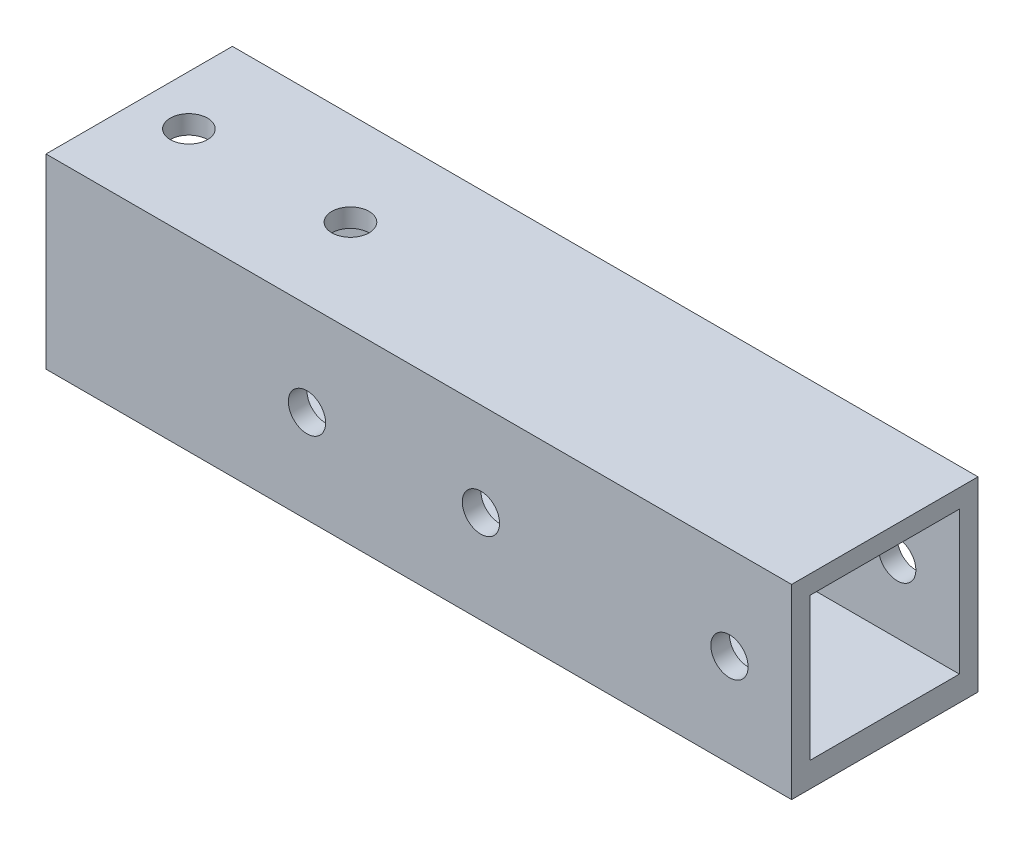
ISO-10303-21;
HEADER;
FILE_DESCRIPTION(('STEP AP214'),'2;1');
FILE_NAME('part.step','',(''),(''),'','','');
FILE_SCHEMA(('AUTOMOTIVE_DESIGN { 1 0 10303 214 1 1 1 1 }'));
ENDSEC;
DATA;
#1=APPLICATION_CONTEXT('core data for automotive mechanical design processes');
#2=APPLICATION_PROTOCOL_DEFINITION('international standard','automotive_design',2000,#1);
#3=PRODUCT_CONTEXT('',#1,'mechanical');
#4=PRODUCT('Part','Part','',(#3));
#5=PRODUCT_RELATED_PRODUCT_CATEGORY('part','',(#4));
#6=PRODUCT_DEFINITION_FORMATION('','',#4);
#7=PRODUCT_DEFINITION_CONTEXT('part definition',#1,'design');
#8=PRODUCT_DEFINITION('design','',#6,#7);
#9=PRODUCT_DEFINITION_SHAPE('','',#8);
#10=(LENGTH_UNIT() NAMED_UNIT(*) SI_UNIT(.MILLI.,.METRE.));
#11=(NAMED_UNIT(*) PLANE_ANGLE_UNIT() SI_UNIT($,.RADIAN.));
#12=(NAMED_UNIT(*) SI_UNIT($,.STERADIAN.) SOLID_ANGLE_UNIT());
#13=UNCERTAINTY_MEASURE_WITH_UNIT(LENGTH_MEASURE(1.E-05),#10,'distance_accuracy_value','');
#14=(GEOMETRIC_REPRESENTATION_CONTEXT(3) GLOBAL_UNCERTAINTY_ASSIGNED_CONTEXT((#13)) GLOBAL_UNIT_ASSIGNED_CONTEXT((#10,
#11,#12)) REPRESENTATION_CONTEXT('',''));
#15=CARTESIAN_POINT('',(0.,0.,0.));
#16=DIRECTION('',(0.,0.,1.));
#17=DIRECTION('',(1.,0.,0.));
#18=AXIS2_PLACEMENT_3D('',#15,#16,#17);
#19=CARTESIAN_POINT('',(60.,3.50000000000001,5.99999999999999));
#20=DIRECTION('',(0.,0.,-1.));
#21=DIRECTION('',(-1.,0.,0.));
#22=AXIS2_PLACEMENT_3D('',#19,#20,#21);
#23=PLANE('',#22);
#24=CARTESIAN_POINT('',(21.,0.,5.99999999999999));
#25=DIRECTION('',(0.,0.,-1.));
#26=DIRECTION('',(-1.,0.,0.));
#27=AXIS2_PLACEMENT_3D('',#24,#25,#26);
#28=CIRCLE('',#27,1.5);
#29=CARTESIAN_POINT('',(19.5,0.,5.99999999999999));
#30=VERTEX_POINT('',#29);
#31=EDGE_CURVE('E344',#30,#30,#28,.T.);
#32=ORIENTED_EDGE('',*,*,#31,.F.);
#33=EDGE_LOOP('',(#32));
#34=FACE_BOUND('',#33,.T.);
#35=CARTESIAN_POINT('',(55.,0.,5.99999999999999));
#36=DIRECTION('',(0.,0.,-1.));
#37=DIRECTION('',(-1.,0.,0.));
#38=AXIS2_PLACEMENT_3D('',#35,#36,#37);
#39=CIRCLE('',#38,1.5);
#40=CARTESIAN_POINT('',(53.5,0.,5.99999999999999));
#41=VERTEX_POINT('',#40);
#42=EDGE_CURVE('E248',#41,#41,#39,.T.);
#43=ORIENTED_EDGE('',*,*,#42,.F.);
#44=EDGE_LOOP('',(#43));
#45=FACE_BOUND('',#44,.T.);
#46=CARTESIAN_POINT('',(35.,0.,5.99999999999999));
#47=DIRECTION('',(0.,0.,-1.));
#48=DIRECTION('',(-1.,0.,0.));
#49=AXIS2_PLACEMENT_3D('',#46,#47,#48);
#50=CIRCLE('',#49,1.5);
#51=CARTESIAN_POINT('',(33.5,0.,5.99999999999999));
#52=VERTEX_POINT('',#51);
#53=EDGE_CURVE('E359',#52,#52,#50,.T.);
#54=ORIENTED_EDGE('',*,*,#53,.F.);
#55=EDGE_LOOP('',(#54));
#56=FACE_BOUND('',#55,.T.);
#57=DIRECTION('',(0.,-1.,0.));
#58=VECTOR('',#57,1.);
#59=CARTESIAN_POINT('',(0.,3.50000000000001,5.99999999999999));
#60=LINE('',#59,#58);
#61=CARTESIAN_POINT('',(0.,6.,5.99999999999999));
#62=VERTEX_POINT('',#61);
#63=CARTESIAN_POINT('',(0.,-5.50000000000001,5.99999999999999));
#64=VERTEX_POINT('',#63);
#65=EDGE_CURVE('E131',#62,#64,#60,.T.);
#66=ORIENTED_EDGE('',*,*,#65,.F.);
#67=DIRECTION('',(-1.,0.,0.));
#68=VECTOR('',#67,1.);
#69=CARTESIAN_POINT('',(60.,6.,5.99999999999999));
#70=LINE('',#69,#68);
#71=CARTESIAN_POINT('',(60.,6.,5.99999999999999));
#72=VERTEX_POINT('',#71);
#73=EDGE_CURVE('E12',#72,#62,#70,.T.);
#74=ORIENTED_EDGE('',*,*,#73,.F.);
#75=DIRECTION('',(0.,-1.,0.));
#76=VECTOR('',#75,1.);
#77=CARTESIAN_POINT('',(60.,-5.50000000000001,5.99999999999999));
#78=LINE('',#77,#76);
#79=CARTESIAN_POINT('',(60.,-5.50000000000001,5.99999999999999));
#80=VERTEX_POINT('',#79);
#81=EDGE_CURVE('E160',#72,#80,#78,.T.);
#82=ORIENTED_EDGE('',*,*,#81,.T.);
#83=DIRECTION('',(-1.,0.,0.));
#84=VECTOR('',#83,1.);
#85=CARTESIAN_POINT('',(60.,-5.50000000000001,5.99999999999999));
#86=LINE('',#85,#84);
#87=EDGE_CURVE('E209',#80,#64,#86,.T.);
#88=ORIENTED_EDGE('',*,*,#87,.T.);
#89=EDGE_LOOP('',(#66,#74,#82,#88));
#90=FACE_BOUND('',#89,.T.);
#91=ADVANCED_FACE('F79',(#34,#45,#56,#90),#23,.T.);
#92=CARTESIAN_POINT('',(60.,6.,-6.00000000000001));
#93=DIRECTION('',(0.,-1.,0.));
#94=DIRECTION('',(0.,0.,-1.));
#95=AXIS2_PLACEMENT_3D('',#92,#93,#94);
#96=PLANE('',#95);
#97=CARTESIAN_POINT('',(17.,6.00000000000001,0.));
#98=DIRECTION('',(0.,-1.,0.));
#99=DIRECTION('',(0.,0.,-1.));
#100=AXIS2_PLACEMENT_3D('',#97,#98,#99);
#101=CIRCLE('',#100,1.5);
#102=CARTESIAN_POINT('',(17.,6.00000000000001,-1.5));
#103=VERTEX_POINT('',#102);
#104=EDGE_CURVE('E187',#103,#103,#101,.T.);
#105=ORIENTED_EDGE('',*,*,#104,.F.);
#106=EDGE_LOOP('',(#105));
#107=FACE_BOUND('',#106,.T.);
#108=CARTESIAN_POINT('',(4.,6.00000000000001,0.));
#109=DIRECTION('',(0.,-1.,0.));
#110=DIRECTION('',(0.,0.,-1.));
#111=AXIS2_PLACEMENT_3D('',#108,#109,#110);
#112=CIRCLE('',#111,1.5);
#113=CARTESIAN_POINT('',(4.,6.00000000000001,-1.5));
#114=VERTEX_POINT('',#113);
#115=EDGE_CURVE('E230',#114,#114,#112,.T.);
#116=ORIENTED_EDGE('',*,*,#115,.F.);
#117=EDGE_LOOP('',(#116));
#118=FACE_BOUND('',#117,.T.);
#119=DIRECTION('',(0.,0.,1.));
#120=VECTOR('',#119,1.);
#121=CARTESIAN_POINT('',(0.,6.,-6.00000000000001));
#122=LINE('',#121,#120);
#123=CARTESIAN_POINT('',(0.,6.,-6.00000000000001));
#124=VERTEX_POINT('',#123);
#125=EDGE_CURVE('E168',#124,#62,#122,.T.);
#126=ORIENTED_EDGE('',*,*,#125,.F.);
#127=DIRECTION('',(-1.,0.,0.));
#128=VECTOR('',#127,1.);
#129=CARTESIAN_POINT('',(60.,6.,-6.00000000000001));
#130=LINE('',#129,#128);
#131=CARTESIAN_POINT('',(60.,6.,-6.00000000000001));
#132=VERTEX_POINT('',#131);
#133=EDGE_CURVE('E90',#132,#124,#130,.T.);
#134=ORIENTED_EDGE('',*,*,#133,.F.);
#135=DIRECTION('',(0.,0.,1.));
#136=VECTOR('',#135,1.);
#137=CARTESIAN_POINT('',(60.,6.,5.99999999999999));
#138=LINE('',#137,#136);
#139=EDGE_CURVE('E153',#132,#72,#138,.T.);
#140=ORIENTED_EDGE('',*,*,#139,.T.);
#141=ORIENTED_EDGE('',*,*,#73,.T.);
#142=EDGE_LOOP('',(#126,#134,#140,#141));
#143=FACE_BOUND('',#142,.T.);
#144=ADVANCED_FACE('F167',(#107,#118,#143),#96,.T.);
#145=CARTESIAN_POINT('',(60.,-5.50000000000001,-6.00000000000001));
#146=DIRECTION('',(0.,0.,1.));
#147=DIRECTION('',(1.,0.,0.));
#148=AXIS2_PLACEMENT_3D('',#145,#146,#147);
#149=PLANE('',#148);
#150=CARTESIAN_POINT('',(21.,0.,-6.00000000000001));
#151=DIRECTION('',(0.,0.,1.));
#152=DIRECTION('',(1.,0.,0.));
#153=AXIS2_PLACEMENT_3D('',#150,#151,#152);
#154=CIRCLE('',#153,1.5);
#155=CARTESIAN_POINT('',(22.5,0.,-6.00000000000001));
#156=VERTEX_POINT('',#155);
#157=EDGE_CURVE('E351',#156,#156,#154,.T.);
#158=ORIENTED_EDGE('',*,*,#157,.F.);
#159=EDGE_LOOP('',(#158));
#160=FACE_BOUND('',#159,.T.);
#161=CARTESIAN_POINT('',(55.,0.,-6.00000000000001));
#162=DIRECTION('',(0.,0.,1.));
#163=DIRECTION('',(1.,0.,0.));
#164=AXIS2_PLACEMENT_3D('',#161,#162,#163);
#165=CIRCLE('',#164,1.5);
#166=CARTESIAN_POINT('',(56.5,0.,-6.00000000000001));
#167=VERTEX_POINT('',#166);
#168=EDGE_CURVE('E363',#167,#167,#165,.T.);
#169=ORIENTED_EDGE('',*,*,#168,.F.);
#170=EDGE_LOOP('',(#169));
#171=FACE_BOUND('',#170,.T.);
#172=CARTESIAN_POINT('',(35.,0.,-6.00000000000001));
#173=DIRECTION('',(0.,0.,1.));
#174=DIRECTION('',(1.,0.,0.));
#175=AXIS2_PLACEMENT_3D('',#172,#173,#174);
#176=CIRCLE('',#175,1.5);
#177=CARTESIAN_POINT('',(36.5,0.,-6.00000000000001));
#178=VERTEX_POINT('',#177);
#179=EDGE_CURVE('E355',#178,#178,#176,.T.);
#180=ORIENTED_EDGE('',*,*,#179,.F.);
#181=EDGE_LOOP('',(#180));
#182=FACE_BOUND('',#181,.T.);
#183=DIRECTION('',(0.,1.,0.));
#184=VECTOR('',#183,1.);
#185=CARTESIAN_POINT('',(0.,-5.50000000000001,-6.00000000000001));
#186=LINE('',#185,#184);
#187=CARTESIAN_POINT('',(0.,-5.50000000000001,-6.00000000000001));
#188=VERTEX_POINT('',#187);
#189=EDGE_CURVE('E203',#188,#124,#186,.T.);
#190=ORIENTED_EDGE('',*,*,#189,.F.);
#191=DIRECTION('',(-1.,0.,0.));
#192=VECTOR('',#191,1.);
#193=CARTESIAN_POINT('',(60.,-5.50000000000001,-6.00000000000001));
#194=LINE('',#193,#192);
#195=CARTESIAN_POINT('',(60.,-5.50000000000001,-6.00000000000001));
#196=VERTEX_POINT('',#195);
#197=EDGE_CURVE('E172',#196,#188,#194,.T.);
#198=ORIENTED_EDGE('',*,*,#197,.F.);
#199=DIRECTION('',(0.,1.,0.));
#200=VECTOR('',#199,1.);
#201=CARTESIAN_POINT('',(60.,4.00000000000001,-6.));
#202=LINE('',#201,#200);
#203=EDGE_CURVE('E157',#196,#132,#202,.T.);
#204=ORIENTED_EDGE('',*,*,#203,.T.);
#205=ORIENTED_EDGE('',*,*,#133,.T.);
#206=EDGE_LOOP('',(#190,#198,#204,#205));
#207=FACE_BOUND('',#206,.T.);
#208=ADVANCED_FACE('F174',(#160,#171,#182,#207),#149,.T.);
#209=CARTESIAN_POINT('',(60.,-7.50000000000001,7.49999999999999));
#210=DIRECTION('',(0.,0.,-1.));
#211=DIRECTION('',(0.,1.,0.));
#212=AXIS2_PLACEMENT_3D('',#209,#210,#211);
#213=PLANE('',#212);
#214=CARTESIAN_POINT('',(21.,0.,7.49999999999999));
#215=DIRECTION('',(0.,0.,-1.));
#216=DIRECTION('',(-1.,0.,0.));
#217=AXIS2_PLACEMENT_3D('',#214,#215,#216);
#218=CIRCLE('',#217,1.5);
#219=CARTESIAN_POINT('',(19.5,0.,7.49999999999999));
#220=VERTEX_POINT('',#219);
#221=EDGE_CURVE('E333',#220,#220,#218,.T.);
#222=ORIENTED_EDGE('',*,*,#221,.T.);
#223=EDGE_LOOP('',(#222));
#224=FACE_BOUND('',#223,.T.);
#225=CARTESIAN_POINT('',(55.,0.,7.49999999999997));
#226=DIRECTION('',(0.,0.,1.));
#227=DIRECTION('',(1.,0.,0.));
#228=AXIS2_PLACEMENT_3D('',#225,#226,#227);
#229=CIRCLE('',#228,1.5);
#230=CARTESIAN_POINT('',(56.5,0.,7.49999999999997));
#231=VERTEX_POINT('',#230);
#232=EDGE_CURVE('E337',#231,#231,#229,.T.);
#233=ORIENTED_EDGE('',*,*,#232,.F.);
#234=EDGE_LOOP('',(#233));
#235=FACE_BOUND('',#234,.T.);
#236=CARTESIAN_POINT('',(35.,0.,7.49999999999997));
#237=DIRECTION('',(0.,0.,1.));
#238=DIRECTION('',(1.,0.,0.));
#239=AXIS2_PLACEMENT_3D('',#236,#237,#238);
#240=CIRCLE('',#239,1.5);
#241=CARTESIAN_POINT('',(36.5,0.,7.49999999999997));
#242=VERTEX_POINT('',#241);
#243=EDGE_CURVE('E340',#242,#242,#240,.T.);
#244=ORIENTED_EDGE('',*,*,#243,.F.);
#245=EDGE_LOOP('',(#244));
#246=FACE_BOUND('',#245,.T.);
#247=DIRECTION('',(0.,-1.,0.));
#248=VECTOR('',#247,1.);
#249=CARTESIAN_POINT('',(0.,-7.50000000000001,7.49999999999999));
#250=LINE('',#249,#248);
#251=CARTESIAN_POINT('',(0.,7.5,7.49999999999999));
#252=VERTEX_POINT('',#251);
#253=CARTESIAN_POINT('',(0.,-7.50000000000001,7.49999999999999));
#254=VERTEX_POINT('',#253);
#255=EDGE_CURVE('E182',#252,#254,#250,.T.);
#256=ORIENTED_EDGE('',*,*,#255,.T.);
#257=DIRECTION('',(-1.,0.,0.));
#258=VECTOR('',#257,1.);
#259=CARTESIAN_POINT('',(60.,-7.50000000000001,7.49999999999999));
#260=LINE('',#259,#258);
#261=CARTESIAN_POINT('',(60.,-7.50000000000001,7.49999999999999));
#262=VERTEX_POINT('',#261);
#263=EDGE_CURVE('E222',#262,#254,#260,.T.);
#264=ORIENTED_EDGE('',*,*,#263,.F.);
#265=DIRECTION('',(0.,-1.,0.));
#266=VECTOR('',#265,1.);
#267=CARTESIAN_POINT('',(60.,6.,7.49999999999999));
#268=LINE('',#267,#266);
#269=CARTESIAN_POINT('',(60.,7.5,7.49999999999999));
#270=VERTEX_POINT('',#269);
#271=EDGE_CURVE('E140',#270,#262,#268,.T.);
#272=ORIENTED_EDGE('',*,*,#271,.F.);
#273=DIRECTION('',(-1.,0.,0.));
#274=VECTOR('',#273,1.);
#275=CARTESIAN_POINT('',(60.,7.5,7.49999999999999));
#276=LINE('',#275,#274);
#277=EDGE_CURVE('E212',#270,#252,#276,.T.);
#278=ORIENTED_EDGE('',*,*,#277,.T.);
#279=EDGE_LOOP('',(#256,#264,#272,#278));
#280=FACE_BOUND('',#279,.T.);
#281=ADVANCED_FACE('F81',(#224,#235,#246,#280),#213,.F.);
#282=CARTESIAN_POINT('',(60.,-7.50000000000001,-6.00000000000001));
#283=DIRECTION('',(0.,1.,0.));
#284=DIRECTION('',(0.,0.,1.));
#285=AXIS2_PLACEMENT_3D('',#282,#283,#284);
#286=PLANE('',#285);
#287=CARTESIAN_POINT('',(17.,-7.50000000000001,0.));
#288=DIRECTION('',(0.,1.,0.));
#289=DIRECTION('',(0.,0.,1.));
#290=AXIS2_PLACEMENT_3D('',#287,#288,#289);
#291=CIRCLE('',#290,1.5);
#292=CARTESIAN_POINT('',(17.,-7.50000000000001,1.5));
#293=VERTEX_POINT('',#292);
#294=EDGE_CURVE('E231',#293,#293,#291,.T.);
#295=ORIENTED_EDGE('',*,*,#294,.T.);
#296=EDGE_LOOP('',(#295));
#297=FACE_BOUND('',#296,.T.);
#298=CARTESIAN_POINT('',(4.,-7.50000000000001,0.));
#299=DIRECTION('',(0.,1.,0.));
#300=DIRECTION('',(0.,0.,1.));
#301=AXIS2_PLACEMENT_3D('',#298,#299,#300);
#302=CIRCLE('',#301,1.5);
#303=CARTESIAN_POINT('',(4.,-7.50000000000001,1.5));
#304=VERTEX_POINT('',#303);
#305=EDGE_CURVE('E245',#304,#304,#302,.T.);
#306=ORIENTED_EDGE('',*,*,#305,.T.);
#307=EDGE_LOOP('',(#306));
#308=FACE_BOUND('',#307,.T.);
#309=DIRECTION('',(0.,0.,-1.));
#310=VECTOR('',#309,1.);
#311=CARTESIAN_POINT('',(0.,-7.50000000000001,-6.00000000000001));
#312=LINE('',#311,#310);
#313=CARTESIAN_POINT('',(0.,-7.50000000000001,-7.50000000000001));
#314=VERTEX_POINT('',#313);
#315=EDGE_CURVE('E186',#254,#314,#312,.T.);
#316=ORIENTED_EDGE('',*,*,#315,.T.);
#317=DIRECTION('',(-1.,0.,0.));
#318=VECTOR('',#317,1.);
#319=CARTESIAN_POINT('',(60.,-7.50000000000001,-7.50000000000001));
#320=LINE('',#319,#318);
#321=CARTESIAN_POINT('',(60.,-7.50000000000001,-7.50000000000001));
#322=VERTEX_POINT('',#321);
#323=EDGE_CURVE('E218',#322,#314,#320,.T.);
#324=ORIENTED_EDGE('',*,*,#323,.F.);
#325=DIRECTION('',(0.,0.,-1.));
#326=VECTOR('',#325,1.);
#327=CARTESIAN_POINT('',(60.,-7.50000000000001,6.00000000000001));
#328=LINE('',#327,#326);
#329=EDGE_CURVE('E265',#262,#322,#328,.T.);
#330=ORIENTED_EDGE('',*,*,#329,.F.);
#331=ORIENTED_EDGE('',*,*,#263,.T.);
#332=EDGE_LOOP('',(#316,#324,#330,#331));
#333=FACE_BOUND('',#332,.T.);
#334=ADVANCED_FACE('F307',(#297,#308,#333),#286,.F.);
#335=CARTESIAN_POINT('',(60.,7.5,-7.5));
#336=DIRECTION('',(0.,0.,1.));
#337=DIRECTION('',(1.,0.,0.));
#338=AXIS2_PLACEMENT_3D('',#335,#336,#337);
#339=PLANE('',#338);
#340=CARTESIAN_POINT('',(21.,0.,-7.5));
#341=DIRECTION('',(0.,0.,-1.));
#342=DIRECTION('',(-1.,0.,0.));
#343=AXIS2_PLACEMENT_3D('',#340,#341,#342);
#344=CIRCLE('',#343,1.5);
#345=CARTESIAN_POINT('',(19.5,0.,-7.5));
#346=VERTEX_POINT('',#345);
#347=EDGE_CURVE('E551',#346,#346,#344,.T.);
#348=ORIENTED_EDGE('',*,*,#347,.F.);
#349=EDGE_LOOP('',(#348));
#350=FACE_BOUND('',#349,.T.);
#351=CARTESIAN_POINT('',(55.,0.,-7.50000000000001));
#352=DIRECTION('',(0.,0.,1.));
#353=DIRECTION('',(1.,0.,0.));
#354=AXIS2_PLACEMENT_3D('',#351,#352,#353);
#355=CIRCLE('',#354,1.5);
#356=CARTESIAN_POINT('',(56.5,0.,-7.50000000000001));
#357=VERTEX_POINT('',#356);
#358=EDGE_CURVE('E360',#357,#357,#355,.T.);
#359=ORIENTED_EDGE('',*,*,#358,.T.);
#360=EDGE_LOOP('',(#359));
#361=FACE_BOUND('',#360,.T.);
#362=CARTESIAN_POINT('',(35.,0.,-7.50000000000001));
#363=DIRECTION('',(0.,0.,1.));
#364=DIRECTION('',(1.,0.,0.));
#365=AXIS2_PLACEMENT_3D('',#362,#363,#364);
#366=CIRCLE('',#365,1.5);
#367=CARTESIAN_POINT('',(36.5,0.,-7.50000000000001));
#368=VERTEX_POINT('',#367);
#369=EDGE_CURVE('E343',#368,#368,#366,.T.);
#370=ORIENTED_EDGE('',*,*,#369,.T.);
#371=EDGE_LOOP('',(#370));
#372=FACE_BOUND('',#371,.T.);
#373=DIRECTION('',(0.,1.,0.));
#374=VECTOR('',#373,1.);
#375=CARTESIAN_POINT('',(0.,7.5,-7.5));
#376=LINE('',#375,#374);
#377=CARTESIAN_POINT('',(0.,7.5,-7.5));
#378=VERTEX_POINT('',#377);
#379=EDGE_CURVE('E191',#314,#378,#376,.T.);
#380=ORIENTED_EDGE('',*,*,#379,.T.);
#381=DIRECTION('',(-1.,0.,0.));
#382=VECTOR('',#381,1.);
#383=CARTESIAN_POINT('',(60.,7.5,-7.5));
#384=LINE('',#383,#382);
#385=CARTESIAN_POINT('',(60.,7.5,-7.5));
#386=VERTEX_POINT('',#385);
#387=EDGE_CURVE('E178',#386,#378,#384,.T.);
#388=ORIENTED_EDGE('',*,*,#387,.F.);
#389=DIRECTION('',(0.,1.,0.));
#390=VECTOR('',#389,1.);
#391=CARTESIAN_POINT('',(60.,-7.50000000000001,-7.50000000000001));
#392=LINE('',#391,#390);
#393=EDGE_CURVE('E268',#322,#386,#392,.T.);
#394=ORIENTED_EDGE('',*,*,#393,.F.);
#395=ORIENTED_EDGE('',*,*,#323,.T.);
#396=EDGE_LOOP('',(#380,#388,#394,#395));
#397=FACE_BOUND('',#396,.T.);
#398=ADVANCED_FACE('F304',(#350,#361,#372,#397),#339,.F.);
#399=CARTESIAN_POINT('',(60.,7.50000000000001,6.));
#400=DIRECTION('',(0.,-1.,0.));
#401=DIRECTION('',(0.,0.,-1.));
#402=AXIS2_PLACEMENT_3D('',#399,#400,#401);
#403=PLANE('',#402);
#404=CARTESIAN_POINT('',(17.,7.50000000000001,0.));
#405=DIRECTION('',(0.,1.,0.));
#406=DIRECTION('',(0.,0.,1.));
#407=AXIS2_PLACEMENT_3D('',#404,#405,#406);
#408=CIRCLE('',#407,1.5);
#409=CARTESIAN_POINT('',(17.,7.50000000000001,1.5));
#410=VERTEX_POINT('',#409);
#411=EDGE_CURVE('E239',#410,#410,#408,.T.);
#412=ORIENTED_EDGE('',*,*,#411,.F.);
#413=EDGE_LOOP('',(#412));
#414=FACE_BOUND('',#413,.T.);
#415=CARTESIAN_POINT('',(4.,7.50000000000001,0.));
#416=DIRECTION('',(0.,1.,0.));
#417=DIRECTION('',(0.,0.,1.));
#418=AXIS2_PLACEMENT_3D('',#415,#416,#417);
#419=CIRCLE('',#418,1.5);
#420=CARTESIAN_POINT('',(4.,7.50000000000001,1.5));
#421=VERTEX_POINT('',#420);
#422=EDGE_CURVE('E254',#421,#421,#419,.T.);
#423=ORIENTED_EDGE('',*,*,#422,.F.);
#424=EDGE_LOOP('',(#423));
#425=FACE_BOUND('',#424,.T.);
#426=DIRECTION('',(0.,0.,1.));
#427=VECTOR('',#426,1.);
#428=CARTESIAN_POINT('',(0.,7.50000000000001,6.));
#429=LINE('',#428,#427);
#430=EDGE_CURVE('E195',#378,#252,#429,.T.);
#431=ORIENTED_EDGE('',*,*,#430,.T.);
#432=ORIENTED_EDGE('',*,*,#277,.F.);
#433=DIRECTION('',(0.,0.,1.));
#434=VECTOR('',#433,1.);
#435=CARTESIAN_POINT('',(60.,7.5,7.49999999999999));
#436=LINE('',#435,#434);
#437=EDGE_CURVE('E208',#386,#270,#436,.T.);
#438=ORIENTED_EDGE('',*,*,#437,.F.);
#439=ORIENTED_EDGE('',*,*,#387,.T.);
#440=EDGE_LOOP('',(#431,#432,#438,#439));
#441=FACE_BOUND('',#440,.T.);
#442=ADVANCED_FACE('F301',(#414,#425,#441),#403,.F.);
#443=CARTESIAN_POINT('',(60.,-5.50000000000001,3.5));
#444=DIRECTION('',(0.,1.,0.));
#445=DIRECTION('',(0.,0.,1.));
#446=AXIS2_PLACEMENT_3D('',#443,#444,#445);
#447=PLANE('',#446);
#448=CARTESIAN_POINT('',(17.,-5.50000000000001,0.));
#449=DIRECTION('',(0.,1.,0.));
#450=DIRECTION('',(0.,0.,1.));
#451=AXIS2_PLACEMENT_3D('',#448,#449,#450);
#452=CIRCLE('',#451,1.5);
#453=CARTESIAN_POINT('',(17.,-5.50000000000001,1.5));
#454=VERTEX_POINT('',#453);
#455=EDGE_CURVE('E83',#454,#454,#452,.T.);
#456=ORIENTED_EDGE('',*,*,#455,.F.);
#457=EDGE_LOOP('',(#456));
#458=FACE_BOUND('',#457,.T.);
#459=CARTESIAN_POINT('',(4.,-5.50000000000001,0.));
#460=DIRECTION('',(0.,1.,0.));
#461=DIRECTION('',(0.,0.,1.));
#462=AXIS2_PLACEMENT_3D('',#459,#460,#461);
#463=CIRCLE('',#462,1.5);
#464=CARTESIAN_POINT('',(4.,-5.50000000000001,1.5));
#465=VERTEX_POINT('',#464);
#466=EDGE_CURVE('E227',#465,#465,#463,.T.);
#467=ORIENTED_EDGE('',*,*,#466,.F.);
#468=EDGE_LOOP('',(#467));
#469=FACE_BOUND('',#468,.T.);
#470=DIRECTION('',(0.,0.,-1.));
#471=VECTOR('',#470,1.);
#472=CARTESIAN_POINT('',(0.,-5.50000000000001,3.5));
#473=LINE('',#472,#471);
#474=EDGE_CURVE('E127',#64,#188,#473,.T.);
#475=ORIENTED_EDGE('',*,*,#474,.F.);
#476=ORIENTED_EDGE('',*,*,#87,.F.);
#477=DIRECTION('',(0.,0.,-1.));
#478=VECTOR('',#477,1.);
#479=CARTESIAN_POINT('',(60.,-5.50000000000001,-3.5));
#480=LINE('',#479,#478);
#481=EDGE_CURVE('E99',#80,#196,#480,.T.);
#482=ORIENTED_EDGE('',*,*,#481,.T.);
#483=ORIENTED_EDGE('',*,*,#197,.T.);
#484=EDGE_LOOP('',(#475,#476,#482,#483));
#485=FACE_BOUND('',#484,.T.);
#486=ADVANCED_FACE('F273',(#458,#469,#485),#447,.T.);
#487=CARTESIAN_POINT('',(60.,0.,0.));
#488=DIRECTION('',(-1.,0.,0.));
#489=DIRECTION('',(0.,0.,1.));
#490=AXIS2_PLACEMENT_3D('',#487,#488,#489);
#491=PLANE('',#490);
#492=ORIENTED_EDGE('',*,*,#437,.T.);
#493=ORIENTED_EDGE('',*,*,#271,.T.);
#494=ORIENTED_EDGE('',*,*,#329,.T.);
#495=ORIENTED_EDGE('',*,*,#393,.T.);
#496=EDGE_LOOP('',(#492,#493,#494,#495));
#497=FACE_BOUND('',#496,.T.);
#498=ORIENTED_EDGE('',*,*,#81,.F.);
#499=ORIENTED_EDGE('',*,*,#139,.F.);
#500=ORIENTED_EDGE('',*,*,#203,.F.);
#501=ORIENTED_EDGE('',*,*,#481,.F.);
#502=EDGE_LOOP('',(#498,#499,#500,#501));
#503=FACE_BOUND('',#502,.T.);
#504=ADVANCED_FACE('F155',(#497,#503),#491,.F.);
#505=CARTESIAN_POINT('',(0.,0.,0.));
#506=DIRECTION('',(-1.,0.,0.));
#507=DIRECTION('',(0.,0.,1.));
#508=AXIS2_PLACEMENT_3D('',#505,#506,#507);
#509=PLANE('',#508);
#510=ORIENTED_EDGE('',*,*,#255,.F.);
#511=ORIENTED_EDGE('',*,*,#430,.F.);
#512=ORIENTED_EDGE('',*,*,#379,.F.);
#513=ORIENTED_EDGE('',*,*,#315,.F.);
#514=EDGE_LOOP('',(#510,#511,#512,#513));
#515=FACE_BOUND('',#514,.T.);
#516=ORIENTED_EDGE('',*,*,#65,.T.);
#517=ORIENTED_EDGE('',*,*,#474,.T.);
#518=ORIENTED_EDGE('',*,*,#189,.T.);
#519=ORIENTED_EDGE('',*,*,#125,.T.);
#520=EDGE_LOOP('',(#516,#517,#518,#519));
#521=FACE_BOUND('',#520,.T.);
#522=ADVANCED_FACE('F274',(#515,#521),#509,.T.);
#523=CARTESIAN_POINT('',(4.,-7.50000000000001,0.));
#524=DIRECTION('',(0.,1.,0.));
#525=DIRECTION('',(0.,0.,1.));
#526=AXIS2_PLACEMENT_3D('',#523,#524,#525);
#527=CYLINDRICAL_SURFACE('',#526,1.5);
#528=ORIENTED_EDGE('',*,*,#466,.T.);
#529=EDGE_LOOP('',(#528));
#530=FACE_BOUND('',#529,.T.);
#531=ORIENTED_EDGE('',*,*,#305,.F.);
#532=EDGE_LOOP('',(#531));
#533=FACE_BOUND('',#532,.T.);
#534=ADVANCED_FACE('F276',(#530,#533),#527,.F.);
#535=CARTESIAN_POINT('',(17.,-7.50000000000001,0.));
#536=DIRECTION('',(0.,1.,0.));
#537=DIRECTION('',(0.,0.,1.));
#538=AXIS2_PLACEMENT_3D('',#535,#536,#537);
#539=CYLINDRICAL_SURFACE('',#538,1.5);
#540=ORIENTED_EDGE('',*,*,#455,.T.);
#541=EDGE_LOOP('',(#540));
#542=FACE_BOUND('',#541,.T.);
#543=ORIENTED_EDGE('',*,*,#294,.F.);
#544=EDGE_LOOP('',(#543));
#545=FACE_BOUND('',#544,.T.);
#546=ADVANCED_FACE('F283',(#542,#545),#539,.F.);
#547=ORIENTED_EDGE('',*,*,#115,.T.);
#548=EDGE_LOOP('',(#547));
#549=FACE_BOUND('',#548,.T.);
#550=ORIENTED_EDGE('',*,*,#422,.T.);
#551=EDGE_LOOP('',(#550));
#552=FACE_BOUND('',#551,.T.);
#553=ADVANCED_FACE('F285',(#549,#552),#527,.F.);
#554=ORIENTED_EDGE('',*,*,#104,.T.);
#555=EDGE_LOOP('',(#554));
#556=FACE_BOUND('',#555,.T.);
#557=ORIENTED_EDGE('',*,*,#411,.T.);
#558=EDGE_LOOP('',(#557));
#559=FACE_BOUND('',#558,.T.);
#560=ADVANCED_FACE('F390',(#556,#559),#539,.F.);
#561=CARTESIAN_POINT('',(35.,0.,-7.50000000000001));
#562=DIRECTION('',(0.,0.,1.));
#563=DIRECTION('',(1.,0.,0.));
#564=AXIS2_PLACEMENT_3D('',#561,#562,#563);
#565=CYLINDRICAL_SURFACE('',#564,1.5);
#566=ORIENTED_EDGE('',*,*,#179,.T.);
#567=EDGE_LOOP('',(#566));
#568=FACE_BOUND('',#567,.T.);
#569=ORIENTED_EDGE('',*,*,#369,.F.);
#570=EDGE_LOOP('',(#569));
#571=FACE_BOUND('',#570,.T.);
#572=ADVANCED_FACE('F381',(#568,#571),#565,.F.);
#573=CARTESIAN_POINT('',(55.,0.,-7.50000000000001));
#574=DIRECTION('',(0.,0.,1.));
#575=DIRECTION('',(1.,0.,0.));
#576=AXIS2_PLACEMENT_3D('',#573,#574,#575);
#577=CYLINDRICAL_SURFACE('',#576,1.5);
#578=ORIENTED_EDGE('',*,*,#168,.T.);
#579=EDGE_LOOP('',(#578));
#580=FACE_BOUND('',#579,.T.);
#581=ORIENTED_EDGE('',*,*,#358,.F.);
#582=EDGE_LOOP('',(#581));
#583=FACE_BOUND('',#582,.T.);
#584=ADVANCED_FACE('F379',(#580,#583),#577,.F.);
#585=ORIENTED_EDGE('',*,*,#53,.T.);
#586=EDGE_LOOP('',(#585));
#587=FACE_BOUND('',#586,.T.);
#588=ORIENTED_EDGE('',*,*,#243,.T.);
#589=EDGE_LOOP('',(#588));
#590=FACE_BOUND('',#589,.T.);
#591=ADVANCED_FACE('F377',(#587,#590),#565,.F.);
#592=ORIENTED_EDGE('',*,*,#42,.T.);
#593=EDGE_LOOP('',(#592));
#594=FACE_BOUND('',#593,.T.);
#595=ORIENTED_EDGE('',*,*,#232,.T.);
#596=EDGE_LOOP('',(#595));
#597=FACE_BOUND('',#596,.T.);
#598=ADVANCED_FACE('F372',(#594,#597),#577,.F.);
#599=CARTESIAN_POINT('',(21.,0.,7.49999999999999));
#600=DIRECTION('',(0.,0.,-1.));
#601=DIRECTION('',(-1.,0.,0.));
#602=AXIS2_PLACEMENT_3D('',#599,#600,#601);
#603=CYLINDRICAL_SURFACE('',#602,1.5);
#604=ORIENTED_EDGE('',*,*,#157,.T.);
#605=EDGE_LOOP('',(#604));
#606=FACE_BOUND('',#605,.T.);
#607=ORIENTED_EDGE('',*,*,#347,.T.);
#608=EDGE_LOOP('',(#607));
#609=FACE_BOUND('',#608,.T.);
#610=ADVANCED_FACE('F386',(#606,#609),#603,.F.);
#611=ORIENTED_EDGE('',*,*,#31,.T.);
#612=EDGE_LOOP('',(#611));
#613=FACE_BOUND('',#612,.T.);
#614=ORIENTED_EDGE('',*,*,#221,.F.);
#615=EDGE_LOOP('',(#614));
#616=FACE_BOUND('',#615,.T.);
#617=ADVANCED_FACE('F535',(#613,#616),#603,.F.);
#618=CLOSED_SHELL('',(#91,#144,#208,#281,#334,#398,#442,#486,#504,#522,#534,#546,#553,#560,#572,
#584,#591,#598,#610,#617));
#619=MANIFOLD_SOLID_BREP('B2',#618);
#620=ADVANCED_BREP_SHAPE_REPRESENTATION('',(#18,#619),#14);
#621=SHAPE_DEFINITION_REPRESENTATION(#9,#620);
ENDSEC;
END-ISO-10303-21;
